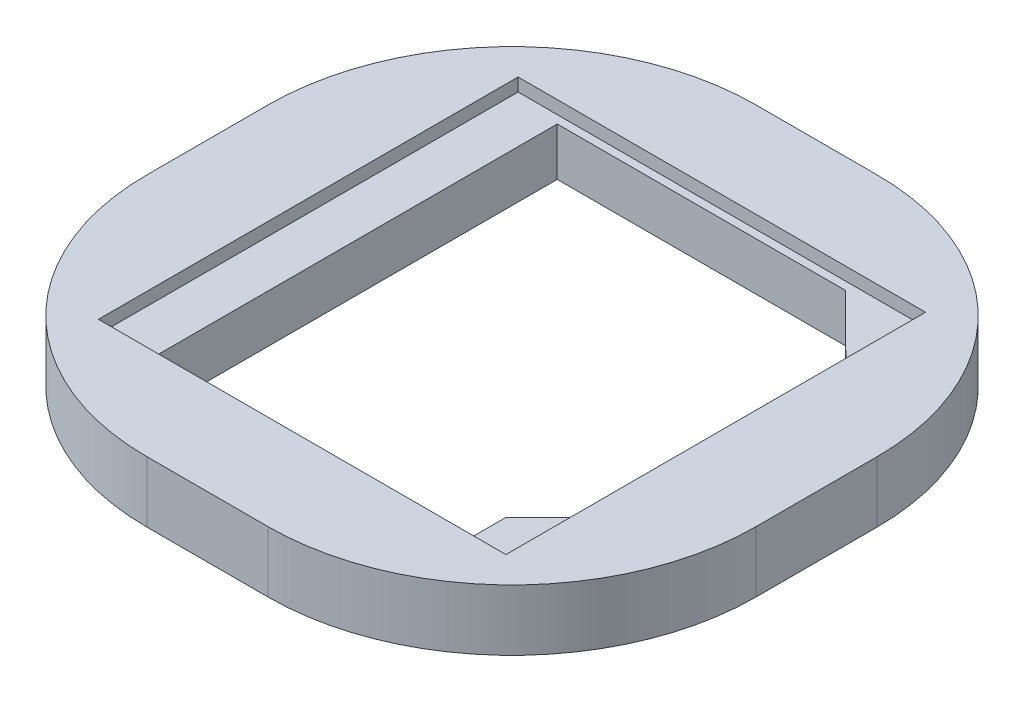
ISO-10303-21;
HEADER;
FILE_DESCRIPTION(('STEP AP214'),'2;1');
FILE_NAME('part.step','',(''),(''),'','','');
FILE_SCHEMA(('AUTOMOTIVE_DESIGN { 1 0 10303 214 1 1 1 1 }'));
ENDSEC;
DATA;
#1=APPLICATION_CONTEXT('core data for automotive mechanical design processes');
#2=APPLICATION_PROTOCOL_DEFINITION('international standard','automotive_design',2000,#1);
#3=PRODUCT_CONTEXT('',#1,'mechanical');
#4=PRODUCT('Part','Part','',(#3));
#5=PRODUCT_RELATED_PRODUCT_CATEGORY('part','',(#4));
#6=PRODUCT_DEFINITION_FORMATION('','',#4);
#7=PRODUCT_DEFINITION_CONTEXT('part definition',#1,'design');
#8=PRODUCT_DEFINITION('design','',#6,#7);
#9=PRODUCT_DEFINITION_SHAPE('','',#8);
#10=(LENGTH_UNIT() NAMED_UNIT(*) SI_UNIT(.MILLI.,.METRE.));
#11=(NAMED_UNIT(*) PLANE_ANGLE_UNIT() SI_UNIT($,.RADIAN.));
#12=(NAMED_UNIT(*) SI_UNIT($,.STERADIAN.) SOLID_ANGLE_UNIT());
#13=UNCERTAINTY_MEASURE_WITH_UNIT(LENGTH_MEASURE(1.E-05),#10,'distance_accuracy_value','');
#14=(GEOMETRIC_REPRESENTATION_CONTEXT(3) GLOBAL_UNCERTAINTY_ASSIGNED_CONTEXT((#13)) GLOBAL_UNIT_ASSIGNED_CONTEXT((#10,
#11,#12)) REPRESENTATION_CONTEXT('',''));
#15=CARTESIAN_POINT('',(0.,0.,0.));
#16=DIRECTION('',(0.,0.,1.));
#17=DIRECTION('',(1.,0.,0.));
#18=AXIS2_PLACEMENT_3D('',#15,#16,#17);
#19=CARTESIAN_POINT('',(0.,5.9,0.));
#20=DIRECTION('',(0.,-1.,0.));
#21=DIRECTION('',(0.,0.,-1.));
#22=AXIS2_PLACEMENT_3D('',#19,#20,#21);
#23=PLANE('',#22);
#24=DIRECTION('',(0.,0.,-1.));
#25=VECTOR('',#24,1.);
#26=CARTESIAN_POINT('',(19.4909070437608,5.9,20.2860703771462));
#27=LINE('',#26,#25);
#28=CARTESIAN_POINT('',(19.4909070437608,5.9,25.8));
#29=VERTEX_POINT('',#28);
#30=CARTESIAN_POINT('',(19.4909070437608,5.9,20.2860703771462));
#31=VERTEX_POINT('',#30);
#32=EDGE_CURVE('E188',#29,#31,#27,.T.);
#33=ORIENTED_EDGE('',*,*,#32,.F.);
#34=DIRECTION('',(1.,0.,0.));
#35=VECTOR('',#34,1.);
#36=CARTESIAN_POINT('',(-25.05,5.9,25.8));
#37=LINE('',#36,#35);
#38=CARTESIAN_POINT('',(25.05,5.9,25.8));
#39=VERTEX_POINT('',#38);
#40=EDGE_CURVE('E237',#29,#39,#37,.T.);
#41=ORIENTED_EDGE('',*,*,#40,.T.);
#42=DIRECTION('',(0.,0.,-1.));
#43=VECTOR('',#42,1.);
#44=CARTESIAN_POINT('',(25.05,5.9,25.8));
#45=LINE('',#44,#43);
#46=CARTESIAN_POINT('',(25.05,5.9,14.6953944265383));
#47=VERTEX_POINT('',#46);
#48=EDGE_CURVE('E227',#39,#47,#45,.T.);
#49=ORIENTED_EDGE('',*,*,#48,.T.);
#50=DIRECTION('',(0.705100991681893,0.,-0.709106897110168));
#51=VECTOR('',#50,1.);
#52=CARTESIAN_POINT('',(25.05,5.9,14.6953944265383));
#53=LINE('',#52,#51);
#54=EDGE_CURVE('E540',#31,#47,#53,.T.);
#55=ORIENTED_EDGE('',*,*,#54,.F.);
#56=EDGE_LOOP('',(#33,#41,#49,#55));
#57=FACE_BOUND('',#56,.T.);
#58=ADVANCED_FACE('F39',(#57),#23,.F.);
#59=DIRECTION('',(-0.709106897110168,0.,-0.705100991681893));
#60=VECTOR('',#59,1.);
#61=CARTESIAN_POINT('',(16.1992306819209,5.9,-24.8007262920677));
#62=LINE('',#61,#60);
#63=CARTESIAN_POINT('',(25.05,5.9,-15.9999569739889));
#64=VERTEX_POINT('',#63);
#65=CARTESIAN_POINT('',(16.1992306819209,5.9,-24.8007262920677));
#66=VERTEX_POINT('',#65);
#67=EDGE_CURVE('E535',#64,#66,#62,.T.);
#68=ORIENTED_EDGE('',*,*,#67,.F.);
#69=CARTESIAN_POINT('',(25.05,5.9,-25.8));
#70=VERTEX_POINT('',#69);
#71=EDGE_CURVE('E231',#64,#70,#45,.T.);
#72=ORIENTED_EDGE('',*,*,#71,.T.);
#73=DIRECTION('',(-1.,0.,0.));
#74=VECTOR('',#73,1.);
#75=CARTESIAN_POINT('',(-25.05,5.9,-25.8));
#76=LINE('',#75,#74);
#77=CARTESIAN_POINT('',(-25.05,5.9,-25.8));
#78=VERTEX_POINT('',#77);
#79=EDGE_CURVE('E230',#70,#78,#76,.T.);
#80=ORIENTED_EDGE('',*,*,#79,.T.);
#81=DIRECTION('',(0.,0.,1.));
#82=VECTOR('',#81,1.);
#83=CARTESIAN_POINT('',(-25.05,5.9,25.8));
#84=LINE('',#83,#82);
#85=CARTESIAN_POINT('',(-25.05,5.9,25.8));
#86=VERTEX_POINT('',#85);
#87=EDGE_CURVE('E234',#78,#86,#84,.T.);
#88=ORIENTED_EDGE('',*,*,#87,.T.);
#89=CARTESIAN_POINT('',(-19.2380081819395,5.9,25.8));
#90=VERTEX_POINT('',#89);
#91=EDGE_CURVE('E238',#86,#90,#37,.T.);
#92=ORIENTED_EDGE('',*,*,#91,.T.);
#93=DIRECTION('',(0.,0.,1.));
#94=VECTOR('',#93,1.);
#95=CARTESIAN_POINT('',(-19.2380081819395,5.9,25.8));
#96=LINE('',#95,#94);
#97=CARTESIAN_POINT('',(-19.2380081819395,5.9,-24.8007262920677));
#98=VERTEX_POINT('',#97);
#99=EDGE_CURVE('E195',#98,#90,#96,.T.);
#100=ORIENTED_EDGE('',*,*,#99,.F.);
#101=DIRECTION('',(-1.,0.,0.));
#102=VECTOR('',#101,1.);
#103=CARTESIAN_POINT('',(-19.2380081819395,5.9,-24.8007262920677));
#104=LINE('',#103,#102);
#105=EDGE_CURVE('E198',#66,#98,#104,.T.);
#106=ORIENTED_EDGE('',*,*,#105,.F.);
#107=EDGE_LOOP('',(#68,#72,#80,#88,#92,#100,#106));
#108=FACE_BOUND('',#107,.T.);
#109=ADVANCED_FACE('F347',(#108),#23,.F.);
#110=CARTESIAN_POINT('',(37.45,7.5,37.45));
#111=DIRECTION('',(-1.,0.,0.));
#112=DIRECTION('',(0.,0.,1.));
#113=AXIS2_PLACEMENT_3D('',#110,#111,#112);
#114=PLANE('',#113);
#115=DIRECTION('',(0.,0.,-1.));
#116=VECTOR('',#115,1.);
#117=CARTESIAN_POINT('',(37.45,0.,37.45));
#118=LINE('',#117,#116);
#119=CARTESIAN_POINT('',(37.45,0.,7.45000000000001));
#120=VERTEX_POINT('',#119);
#121=CARTESIAN_POINT('',(37.45,0.,-7.45000000000001));
#122=VERTEX_POINT('',#121);
#123=EDGE_CURVE('E254',#120,#122,#118,.T.);
#124=ORIENTED_EDGE('',*,*,#123,.T.);
#125=DIRECTION('',(0.,-1.,0.));
#126=VECTOR('',#125,1.);
#127=CARTESIAN_POINT('',(37.45,7.5,-7.45000000000001));
#128=LINE('',#127,#126);
#129=CARTESIAN_POINT('',(37.45,7.5,-7.45000000000001));
#130=VERTEX_POINT('',#129);
#131=EDGE_CURVE('E297',#122,#130,#128,.F.);
#132=ORIENTED_EDGE('',*,*,#131,.T.);
#133=DIRECTION('',(0.,0.,-1.));
#134=VECTOR('',#133,1.);
#135=CARTESIAN_POINT('',(37.45,7.5,37.45));
#136=LINE('',#135,#134);
#137=CARTESIAN_POINT('',(37.45,7.5,7.45000000000001));
#138=VERTEX_POINT('',#137);
#139=EDGE_CURVE('E261',#138,#130,#136,.T.);
#140=ORIENTED_EDGE('',*,*,#139,.F.);
#141=DIRECTION('',(0.,-1.,0.));
#142=VECTOR('',#141,1.);
#143=CARTESIAN_POINT('',(37.45,7.5,7.45000000000001));
#144=LINE('',#143,#142);
#145=EDGE_CURVE('E294',#138,#120,#144,.T.);
#146=ORIENTED_EDGE('',*,*,#145,.T.);
#147=EDGE_LOOP('',(#124,#132,#140,#146));
#148=FACE_BOUND('',#147,.T.);
#149=ADVANCED_FACE('F332',(#148),#114,.F.);
#150=CARTESIAN_POINT('',(-37.45,7.5,-37.45));
#151=DIRECTION('',(0.,0.,1.));
#152=DIRECTION('',(1.,0.,0.));
#153=AXIS2_PLACEMENT_3D('',#150,#151,#152);
#154=PLANE('',#153);
#155=DIRECTION('',(-1.,0.,0.));
#156=VECTOR('',#155,1.);
#157=CARTESIAN_POINT('',(-37.45,7.5,-37.45));
#158=LINE('',#157,#156);
#159=CARTESIAN_POINT('',(7.45000000000002,7.5,-37.45));
#160=VERTEX_POINT('',#159);
#161=CARTESIAN_POINT('',(-7.44999999999999,7.5,-37.45));
#162=VERTEX_POINT('',#161);
#163=EDGE_CURVE('E264',#160,#162,#158,.T.);
#164=ORIENTED_EDGE('',*,*,#163,.F.);
#165=DIRECTION('',(0.,-1.,0.));
#166=VECTOR('',#165,1.);
#167=CARTESIAN_POINT('',(7.45000000000002,7.5,-37.45));
#168=LINE('',#167,#166);
#169=CARTESIAN_POINT('',(7.45000000000002,0.,-37.45));
#170=VERTEX_POINT('',#169);
#171=EDGE_CURVE('E283',#160,#170,#168,.T.);
#172=ORIENTED_EDGE('',*,*,#171,.T.);
#173=DIRECTION('',(-1.,0.,0.));
#174=VECTOR('',#173,1.);
#175=CARTESIAN_POINT('',(-37.45,0.,-37.45));
#176=LINE('',#175,#174);
#177=CARTESIAN_POINT('',(-7.44999999999999,0.,-37.45));
#178=VERTEX_POINT('',#177);
#179=EDGE_CURVE('E275',#170,#178,#176,.T.);
#180=ORIENTED_EDGE('',*,*,#179,.T.);
#181=DIRECTION('',(0.,-1.,0.));
#182=VECTOR('',#181,1.);
#183=CARTESIAN_POINT('',(-7.44999999999999,7.5,-37.45));
#184=LINE('',#183,#182);
#185=EDGE_CURVE('E272',#178,#162,#184,.F.);
#186=ORIENTED_EDGE('',*,*,#185,.T.);
#187=EDGE_LOOP('',(#164,#172,#180,#186));
#188=FACE_BOUND('',#187,.T.);
#189=ADVANCED_FACE('F340',(#188),#154,.F.);
#190=CARTESIAN_POINT('',(-37.45,7.5,37.45));
#191=DIRECTION('',(1.,0.,0.));
#192=DIRECTION('',(0.,0.,-1.));
#193=AXIS2_PLACEMENT_3D('',#190,#191,#192);
#194=PLANE('',#193);
#195=DIRECTION('',(0.,0.,1.));
#196=VECTOR('',#195,1.);
#197=CARTESIAN_POINT('',(-37.45,0.,37.45));
#198=LINE('',#197,#196);
#199=CARTESIAN_POINT('',(-37.45,0.,-7.45000000000001));
#200=VERTEX_POINT('',#199);
#201=CARTESIAN_POINT('',(-37.45,0.,7.45000000000001));
#202=VERTEX_POINT('',#201);
#203=EDGE_CURVE('E278',#200,#202,#198,.T.);
#204=ORIENTED_EDGE('',*,*,#203,.T.);
#205=DIRECTION('',(0.,-1.,0.));
#206=VECTOR('',#205,1.);
#207=CARTESIAN_POINT('',(-37.45,7.5,7.45000000000001));
#208=LINE('',#207,#206);
#209=CARTESIAN_POINT('',(-37.45,7.5,7.45000000000001));
#210=VERTEX_POINT('',#209);
#211=EDGE_CURVE('E11',#202,#210,#208,.F.);
#212=ORIENTED_EDGE('',*,*,#211,.T.);
#213=DIRECTION('',(0.,0.,1.));
#214=VECTOR('',#213,1.);
#215=CARTESIAN_POINT('',(-37.45,7.5,37.45));
#216=LINE('',#215,#214);
#217=CARTESIAN_POINT('',(-37.45,7.5,-7.45000000000001));
#218=VERTEX_POINT('',#217);
#219=EDGE_CURVE('E268',#218,#210,#216,.T.);
#220=ORIENTED_EDGE('',*,*,#219,.F.);
#221=DIRECTION('',(0.,-1.,0.));
#222=VECTOR('',#221,1.);
#223=CARTESIAN_POINT('',(-37.45,7.5,-7.45000000000001));
#224=LINE('',#223,#222);
#225=EDGE_CURVE('E47',#218,#200,#224,.T.);
#226=ORIENTED_EDGE('',*,*,#225,.T.);
#227=EDGE_LOOP('',(#204,#212,#220,#226));
#228=FACE_BOUND('',#227,.T.);
#229=ADVANCED_FACE('F314',(#228),#194,.F.);
#230=CARTESIAN_POINT('',(-37.45,7.5,37.45));
#231=DIRECTION('',(0.,0.,-1.));
#232=DIRECTION('',(-1.,0.,0.));
#233=AXIS2_PLACEMENT_3D('',#230,#231,#232);
#234=PLANE('',#233);
#235=DIRECTION('',(1.,0.,0.));
#236=VECTOR('',#235,1.);
#237=CARTESIAN_POINT('',(-37.45,0.,37.45));
#238=LINE('',#237,#236);
#239=CARTESIAN_POINT('',(-7.44999999999999,0.,37.45));
#240=VERTEX_POINT('',#239);
#241=CARTESIAN_POINT('',(7.45000000000002,0.,37.45));
#242=VERTEX_POINT('',#241);
#243=EDGE_CURVE('E265',#240,#242,#238,.T.);
#244=ORIENTED_EDGE('',*,*,#243,.T.);
#245=DIRECTION('',(0.,-1.,0.));
#246=VECTOR('',#245,1.);
#247=CARTESIAN_POINT('',(7.45000000000002,7.5,37.45));
#248=LINE('',#247,#246);
#249=CARTESIAN_POINT('',(7.45000000000002,7.5,37.45));
#250=VERTEX_POINT('',#249);
#251=EDGE_CURVE('E54',#242,#250,#248,.F.);
#252=ORIENTED_EDGE('',*,*,#251,.T.);
#253=DIRECTION('',(1.,0.,0.));
#254=VECTOR('',#253,1.);
#255=CARTESIAN_POINT('',(-37.45,7.5,37.45));
#256=LINE('',#255,#254);
#257=CARTESIAN_POINT('',(-7.44999999999999,7.5,37.45));
#258=VERTEX_POINT('',#257);
#259=EDGE_CURVE('E270',#258,#250,#256,.T.);
#260=ORIENTED_EDGE('',*,*,#259,.F.);
#261=DIRECTION('',(0.,-1.,0.));
#262=VECTOR('',#261,1.);
#263=CARTESIAN_POINT('',(-7.44999999999999,7.5,37.45));
#264=LINE('',#263,#262);
#265=EDGE_CURVE('E306',#258,#240,#264,.T.);
#266=ORIENTED_EDGE('',*,*,#265,.T.);
#267=EDGE_LOOP('',(#244,#252,#260,#266));
#268=FACE_BOUND('',#267,.T.);
#269=ADVANCED_FACE('F323',(#268),#234,.F.);
#270=CARTESIAN_POINT('',(0.,7.5,0.));
#271=DIRECTION('',(0.,-1.,0.));
#272=DIRECTION('',(0.,0.,-1.));
#273=AXIS2_PLACEMENT_3D('',#270,#271,#272);
#274=PLANE('',#273);
#275=DIRECTION('',(-1.,0.,0.));
#276=VECTOR('',#275,1.);
#277=CARTESIAN_POINT('',(-25.05,7.5,-25.8));
#278=LINE('',#277,#276);
#279=CARTESIAN_POINT('',(25.05,7.5,-25.8));
#280=VERTEX_POINT('',#279);
#281=CARTESIAN_POINT('',(-25.05,7.5,-25.8));
#282=VERTEX_POINT('',#281);
#283=EDGE_CURVE('E243',#280,#282,#278,.T.);
#284=ORIENTED_EDGE('',*,*,#283,.F.);
#285=DIRECTION('',(0.,0.,-1.));
#286=VECTOR('',#285,1.);
#287=CARTESIAN_POINT('',(25.05,7.5,25.8));
#288=LINE('',#287,#286);
#289=CARTESIAN_POINT('',(25.05,7.5,25.8));
#290=VERTEX_POINT('',#289);
#291=EDGE_CURVE('E226',#290,#280,#288,.T.);
#292=ORIENTED_EDGE('',*,*,#291,.F.);
#293=DIRECTION('',(1.,0.,0.));
#294=VECTOR('',#293,1.);
#295=CARTESIAN_POINT('',(-25.05,7.5,25.8));
#296=LINE('',#295,#294);
#297=CARTESIAN_POINT('',(-25.05,7.5,25.8));
#298=VERTEX_POINT('',#297);
#299=EDGE_CURVE('E249',#298,#290,#296,.T.);
#300=ORIENTED_EDGE('',*,*,#299,.F.);
#301=DIRECTION('',(0.,0.,1.));
#302=VECTOR('',#301,1.);
#303=CARTESIAN_POINT('',(-25.05,7.5,25.8));
#304=LINE('',#303,#302);
#305=EDGE_CURVE('E246',#282,#298,#304,.T.);
#306=ORIENTED_EDGE('',*,*,#305,.F.);
#307=EDGE_LOOP('',(#284,#292,#300,#306));
#308=FACE_BOUND('',#307,.T.);
#309=ORIENTED_EDGE('',*,*,#139,.T.);
#310=CARTESIAN_POINT('',(7.45000000000002,7.5,-7.45000000000001));
#311=DIRECTION('',(0.,-1.,0.));
#312=DIRECTION('',(0.,0.,-1.));
#313=AXIS2_PLACEMENT_3D('',#310,#311,#312);
#314=CIRCLE('',#313,30.);
#315=EDGE_CURVE('E304',#130,#160,#314,.F.);
#316=ORIENTED_EDGE('',*,*,#315,.T.);
#317=ORIENTED_EDGE('',*,*,#163,.T.);
#318=CARTESIAN_POINT('',(-7.44999999999999,7.5,-7.45000000000001));
#319=DIRECTION('',(0.,-1.,0.));
#320=DIRECTION('',(0.,0.,-1.));
#321=AXIS2_PLACEMENT_3D('',#318,#319,#320);
#322=CIRCLE('',#321,30.);
#323=EDGE_CURVE('E299',#162,#218,#322,.F.);
#324=ORIENTED_EDGE('',*,*,#323,.T.);
#325=ORIENTED_EDGE('',*,*,#219,.T.);
#326=CARTESIAN_POINT('',(-7.44999999999999,7.5,7.45000000000001));
#327=DIRECTION('',(0.,-1.,0.));
#328=DIRECTION('',(0.,0.,-1.));
#329=AXIS2_PLACEMENT_3D('',#326,#327,#328);
#330=CIRCLE('',#329,30.);
#331=EDGE_CURVE('E61',#210,#258,#330,.F.);
#332=ORIENTED_EDGE('',*,*,#331,.T.);
#333=ORIENTED_EDGE('',*,*,#259,.T.);
#334=CARTESIAN_POINT('',(7.45000000000002,7.5,7.45000000000001));
#335=DIRECTION('',(0.,-1.,0.));
#336=DIRECTION('',(0.,0.,-1.));
#337=AXIS2_PLACEMENT_3D('',#334,#335,#336);
#338=CIRCLE('',#337,30.);
#339=EDGE_CURVE('E302',#250,#138,#338,.F.);
#340=ORIENTED_EDGE('',*,*,#339,.T.);
#341=EDGE_LOOP('',(#309,#316,#317,#324,#325,#332,#333,#340));
#342=FACE_BOUND('',#341,.T.);
#343=ADVANCED_FACE('F325',(#308,#342),#274,.F.);
#344=CARTESIAN_POINT('',(0.,0.,0.));
#345=DIRECTION('',(0.,-1.,0.));
#346=DIRECTION('',(0.,0.,-1.));
#347=AXIS2_PLACEMENT_3D('',#344,#345,#346);
#348=PLANE('',#347);
#349=DIRECTION('',(0.,0.,-1.));
#350=VECTOR('',#349,1.);
#351=CARTESIAN_POINT('',(19.4909070437608,0.,20.2860703771462));
#352=LINE('',#351,#350);
#353=CARTESIAN_POINT('',(19.4909070437608,0.,25.8));
#354=VERTEX_POINT('',#353);
#355=CARTESIAN_POINT('',(19.4909070437608,0.,20.2860703771462));
#356=VERTEX_POINT('',#355);
#357=EDGE_CURVE('E185',#354,#356,#352,.T.);
#358=ORIENTED_EDGE('',*,*,#357,.T.);
#359=DIRECTION('',(0.705100991681893,0.,-0.709106897110168));
#360=VECTOR('',#359,1.);
#361=CARTESIAN_POINT('',(25.05,0.,14.6953944265383));
#362=LINE('',#361,#360);
#363=CARTESIAN_POINT('',(25.05,0.,14.6953944265383));
#364=VERTEX_POINT('',#363);
#365=EDGE_CURVE('E171',#356,#364,#362,.T.);
#366=ORIENTED_EDGE('',*,*,#365,.T.);
#367=DIRECTION('',(0.,0.,-1.));
#368=VECTOR('',#367,1.);
#369=CARTESIAN_POINT('',(25.05,0.,-15.9999569739889));
#370=LINE('',#369,#368);
#371=CARTESIAN_POINT('',(25.05,0.,-15.9999569739889));
#372=VERTEX_POINT('',#371);
#373=EDGE_CURVE('E217',#364,#372,#370,.T.);
#374=ORIENTED_EDGE('',*,*,#373,.T.);
#375=DIRECTION('',(-0.709106897110168,0.,-0.705100991681893));
#376=VECTOR('',#375,1.);
#377=CARTESIAN_POINT('',(16.1992306819209,0.,-24.8007262920677));
#378=LINE('',#377,#376);
#379=CARTESIAN_POINT('',(16.1992306819209,0.,-24.8007262920677));
#380=VERTEX_POINT('',#379);
#381=EDGE_CURVE('E213',#372,#380,#378,.T.);
#382=ORIENTED_EDGE('',*,*,#381,.T.);
#383=DIRECTION('',(-1.,0.,0.));
#384=VECTOR('',#383,1.);
#385=CARTESIAN_POINT('',(-19.2380081819395,0.,-24.8007262920677));
#386=LINE('',#385,#384);
#387=CARTESIAN_POINT('',(-19.2380081819395,0.,-24.8007262920677));
#388=VERTEX_POINT('',#387);
#389=EDGE_CURVE('E209',#380,#388,#386,.T.);
#390=ORIENTED_EDGE('',*,*,#389,.T.);
#391=DIRECTION('',(0.,0.,1.));
#392=VECTOR('',#391,1.);
#393=CARTESIAN_POINT('',(-19.2380081819395,0.,25.8));
#394=LINE('',#393,#392);
#395=CARTESIAN_POINT('',(-19.2380081819395,0.,25.8));
#396=VERTEX_POINT('',#395);
#397=EDGE_CURVE('E206',#388,#396,#394,.T.);
#398=ORIENTED_EDGE('',*,*,#397,.T.);
#399=DIRECTION('',(1.,0.,0.));
#400=VECTOR('',#399,1.);
#401=CARTESIAN_POINT('',(19.4909070437608,0.,25.8));
#402=LINE('',#401,#400);
#403=EDGE_CURVE('E194',#396,#354,#402,.T.);
#404=ORIENTED_EDGE('',*,*,#403,.T.);
#405=EDGE_LOOP('',(#358,#366,#374,#382,#390,#398,#404));
#406=FACE_BOUND('',#405,.T.);
#407=ORIENTED_EDGE('',*,*,#179,.F.);
#408=CARTESIAN_POINT('',(7.45000000000002,0.,-7.45000000000001));
#409=DIRECTION('',(0.,-1.,0.));
#410=DIRECTION('',(0.,0.,-1.));
#411=AXIS2_PLACEMENT_3D('',#408,#409,#410);
#412=CIRCLE('',#411,30.);
#413=EDGE_CURVE('E292',#170,#122,#412,.T.);
#414=ORIENTED_EDGE('',*,*,#413,.T.);
#415=ORIENTED_EDGE('',*,*,#123,.F.);
#416=CARTESIAN_POINT('',(7.45000000000002,0.,7.45000000000001));
#417=DIRECTION('',(0.,-1.,0.));
#418=DIRECTION('',(0.,0.,-1.));
#419=AXIS2_PLACEMENT_3D('',#416,#417,#418);
#420=CIRCLE('',#419,30.);
#421=EDGE_CURVE('E290',#120,#242,#420,.T.);
#422=ORIENTED_EDGE('',*,*,#421,.T.);
#423=ORIENTED_EDGE('',*,*,#243,.F.);
#424=CARTESIAN_POINT('',(-7.44999999999999,0.,7.45000000000001));
#425=DIRECTION('',(0.,-1.,0.));
#426=DIRECTION('',(0.,0.,-1.));
#427=AXIS2_PLACEMENT_3D('',#424,#425,#426);
#428=CIRCLE('',#427,30.);
#429=EDGE_CURVE('E288',#240,#202,#428,.T.);
#430=ORIENTED_EDGE('',*,*,#429,.T.);
#431=ORIENTED_EDGE('',*,*,#203,.F.);
#432=CARTESIAN_POINT('',(-7.44999999999999,0.,-7.45000000000001));
#433=DIRECTION('',(0.,-1.,0.));
#434=DIRECTION('',(0.,0.,-1.));
#435=AXIS2_PLACEMENT_3D('',#432,#433,#434);
#436=CIRCLE('',#435,30.);
#437=EDGE_CURVE('E286',#200,#178,#436,.T.);
#438=ORIENTED_EDGE('',*,*,#437,.T.);
#439=EDGE_LOOP('',(#407,#414,#415,#422,#423,#430,#431,#438));
#440=FACE_BOUND('',#439,.T.);
#441=ADVANCED_FACE('F191',(#406,#440),#348,.T.);
#442=CARTESIAN_POINT('',(25.05,5.9,25.8));
#443=DIRECTION('',(1.,0.,0.));
#444=DIRECTION('',(0.,0.,-1.));
#445=AXIS2_PLACEMENT_3D('',#442,#443,#444);
#446=PLANE('',#445);
#447=ORIENTED_EDGE('',*,*,#291,.T.);
#448=DIRECTION('',(0.,1.,0.));
#449=VECTOR('',#448,1.);
#450=CARTESIAN_POINT('',(25.05,5.9,-25.8));
#451=LINE('',#450,#449);
#452=EDGE_CURVE('E241',#70,#280,#451,.T.);
#453=ORIENTED_EDGE('',*,*,#452,.F.);
#454=ORIENTED_EDGE('',*,*,#71,.F.);
#455=DIRECTION('',(0.,1.,0.));
#456=VECTOR('',#455,1.);
#457=CARTESIAN_POINT('',(25.05,-67.2447854484517,-15.9999569739889));
#458=LINE('',#457,#456);
#459=EDGE_CURVE('E216',#372,#64,#458,.T.);
#460=ORIENTED_EDGE('',*,*,#459,.F.);
#461=ORIENTED_EDGE('',*,*,#373,.F.);
#462=DIRECTION('',(0.,1.,0.));
#463=VECTOR('',#462,1.);
#464=CARTESIAN_POINT('',(25.05,-67.2447854484517,14.6953944265383));
#465=LINE('',#464,#463);
#466=EDGE_CURVE('E177',#364,#47,#465,.T.);
#467=ORIENTED_EDGE('',*,*,#466,.T.);
#468=ORIENTED_EDGE('',*,*,#48,.F.);
#469=DIRECTION('',(0.,1.,0.));
#470=VECTOR('',#469,1.);
#471=CARTESIAN_POINT('',(25.05,5.9,25.8));
#472=LINE('',#471,#470);
#473=EDGE_CURVE('E252',#39,#290,#472,.T.);
#474=ORIENTED_EDGE('',*,*,#473,.T.);
#475=EDGE_LOOP('',(#447,#453,#454,#460,#461,#467,#468,#474));
#476=FACE_BOUND('',#475,.T.);
#477=ADVANCED_FACE('F362',(#476),#446,.F.);
#478=CARTESIAN_POINT('',(-25.05,5.9,25.8));
#479=DIRECTION('',(0.,0.,1.));
#480=DIRECTION('',(1.,0.,0.));
#481=AXIS2_PLACEMENT_3D('',#478,#479,#480);
#482=PLANE('',#481);
#483=ORIENTED_EDGE('',*,*,#299,.T.);
#484=ORIENTED_EDGE('',*,*,#473,.F.);
#485=ORIENTED_EDGE('',*,*,#40,.F.);
#486=DIRECTION('',(0.,1.,0.));
#487=VECTOR('',#486,1.);
#488=CARTESIAN_POINT('',(19.4909070437608,-67.2447854484517,25.8));
#489=LINE('',#488,#487);
#490=EDGE_CURVE('E204',#354,#29,#489,.T.);
#491=ORIENTED_EDGE('',*,*,#490,.F.);
#492=ORIENTED_EDGE('',*,*,#403,.F.);
#493=DIRECTION('',(0.,1.,0.));
#494=VECTOR('',#493,1.);
#495=CARTESIAN_POINT('',(-19.2380081819395,-67.2447854484517,25.8));
#496=LINE('',#495,#494);
#497=EDGE_CURVE('E205',#396,#90,#496,.T.);
#498=ORIENTED_EDGE('',*,*,#497,.T.);
#499=ORIENTED_EDGE('',*,*,#91,.F.);
#500=DIRECTION('',(0.,1.,0.));
#501=VECTOR('',#500,1.);
#502=CARTESIAN_POINT('',(-25.05,5.9,25.8));
#503=LINE('',#502,#501);
#504=EDGE_CURVE('E255',#86,#298,#503,.T.);
#505=ORIENTED_EDGE('',*,*,#504,.T.);
#506=EDGE_LOOP('',(#483,#484,#485,#491,#492,#498,#499,#505));
#507=FACE_BOUND('',#506,.T.);
#508=ADVANCED_FACE('F358',(#507),#482,.F.);
#509=CARTESIAN_POINT('',(-25.05,5.9,25.8));
#510=DIRECTION('',(-1.,0.,0.));
#511=DIRECTION('',(0.,0.,1.));
#512=AXIS2_PLACEMENT_3D('',#509,#510,#511);
#513=PLANE('',#512);
#514=ORIENTED_EDGE('',*,*,#305,.T.);
#515=ORIENTED_EDGE('',*,*,#504,.F.);
#516=ORIENTED_EDGE('',*,*,#87,.F.);
#517=DIRECTION('',(0.,1.,0.));
#518=VECTOR('',#517,1.);
#519=CARTESIAN_POINT('',(-25.05,5.9,-25.8));
#520=LINE('',#519,#518);
#521=EDGE_CURVE('E257',#78,#282,#520,.T.);
#522=ORIENTED_EDGE('',*,*,#521,.T.);
#523=EDGE_LOOP('',(#514,#515,#516,#522));
#524=FACE_BOUND('',#523,.T.);
#525=ADVANCED_FACE('F361',(#524),#513,.F.);
#526=CARTESIAN_POINT('',(-25.05,5.9,-25.8));
#527=DIRECTION('',(0.,0.,-1.));
#528=DIRECTION('',(-1.,0.,0.));
#529=AXIS2_PLACEMENT_3D('',#526,#527,#528);
#530=PLANE('',#529);
#531=ORIENTED_EDGE('',*,*,#283,.T.);
#532=ORIENTED_EDGE('',*,*,#521,.F.);
#533=ORIENTED_EDGE('',*,*,#79,.F.);
#534=ORIENTED_EDGE('',*,*,#452,.T.);
#535=EDGE_LOOP('',(#531,#532,#533,#534));
#536=FACE_BOUND('',#535,.T.);
#537=ADVANCED_FACE('F366',(#536),#530,.F.);
#538=CARTESIAN_POINT('',(19.4909070437608,-67.2447854484517,20.2860703771462));
#539=DIRECTION('',(1.,0.,0.));
#540=DIRECTION('',(0.,0.,-1.));
#541=AXIS2_PLACEMENT_3D('',#538,#539,#540);
#542=PLANE('',#541);
#543=ORIENTED_EDGE('',*,*,#490,.T.);
#544=ORIENTED_EDGE('',*,*,#32,.T.);
#545=DIRECTION('',(0.,1.,0.));
#546=VECTOR('',#545,1.);
#547=CARTESIAN_POINT('',(19.4909070437608,-67.2447854484517,20.2860703771462));
#548=LINE('',#547,#546);
#549=EDGE_CURVE('E175',#356,#31,#548,.T.);
#550=ORIENTED_EDGE('',*,*,#549,.F.);
#551=ORIENTED_EDGE('',*,*,#357,.F.);
#552=EDGE_LOOP('',(#543,#544,#550,#551));
#553=FACE_BOUND('',#552,.T.);
#554=ADVANCED_FACE('F184',(#553),#542,.F.);
#555=CARTESIAN_POINT('',(25.05,-67.2447854484517,14.6953944265383));
#556=DIRECTION('',(0.709106897110168,0.,0.705100991681893));
#557=DIRECTION('',(0.705100991681893,0.,-0.709106897110168));
#558=AXIS2_PLACEMENT_3D('',#555,#556,#557);
#559=PLANE('',#558);
#560=ORIENTED_EDGE('',*,*,#549,.T.);
#561=ORIENTED_EDGE('',*,*,#54,.T.);
#562=ORIENTED_EDGE('',*,*,#466,.F.);
#563=ORIENTED_EDGE('',*,*,#365,.F.);
#564=EDGE_LOOP('',(#560,#561,#562,#563));
#565=FACE_BOUND('',#564,.T.);
#566=ADVANCED_FACE('F173',(#565),#559,.F.);
#567=CARTESIAN_POINT('',(16.1992306819209,-67.2447854484517,-24.8007262920677));
#568=DIRECTION('',(0.705100991681893,0.,-0.709106897110168));
#569=DIRECTION('',(-0.709106897110168,0.,-0.705100991681893));
#570=AXIS2_PLACEMENT_3D('',#567,#568,#569);
#571=PLANE('',#570);
#572=ORIENTED_EDGE('',*,*,#459,.T.);
#573=ORIENTED_EDGE('',*,*,#67,.T.);
#574=DIRECTION('',(0.,1.,0.));
#575=VECTOR('',#574,1.);
#576=CARTESIAN_POINT('',(16.1992306819209,-67.2447854484517,-24.8007262920677));
#577=LINE('',#576,#575);
#578=EDGE_CURVE('E212',#380,#66,#577,.T.);
#579=ORIENTED_EDGE('',*,*,#578,.F.);
#580=ORIENTED_EDGE('',*,*,#381,.F.);
#581=EDGE_LOOP('',(#572,#573,#579,#580));
#582=FACE_BOUND('',#581,.T.);
#583=ADVANCED_FACE('F426',(#582),#571,.F.);
#584=CARTESIAN_POINT('',(-19.2380081819395,-67.2447854484517,-24.8007262920677));
#585=DIRECTION('',(0.,0.,-1.));
#586=DIRECTION('',(-1.,0.,0.));
#587=AXIS2_PLACEMENT_3D('',#584,#585,#586);
#588=PLANE('',#587);
#589=ORIENTED_EDGE('',*,*,#578,.T.);
#590=ORIENTED_EDGE('',*,*,#105,.T.);
#591=DIRECTION('',(0.,1.,0.));
#592=VECTOR('',#591,1.);
#593=CARTESIAN_POINT('',(-19.2380081819395,-67.2447854484517,-24.8007262920677));
#594=LINE('',#593,#592);
#595=EDGE_CURVE('E208',#388,#98,#594,.T.);
#596=ORIENTED_EDGE('',*,*,#595,.F.);
#597=ORIENTED_EDGE('',*,*,#389,.F.);
#598=EDGE_LOOP('',(#589,#590,#596,#597));
#599=FACE_BOUND('',#598,.T.);
#600=ADVANCED_FACE('F417',(#599),#588,.F.);
#601=CARTESIAN_POINT('',(-19.2380081819395,-67.2447854484517,25.8));
#602=DIRECTION('',(-1.,0.,0.));
#603=DIRECTION('',(0.,0.,1.));
#604=AXIS2_PLACEMENT_3D('',#601,#602,#603);
#605=PLANE('',#604);
#606=ORIENTED_EDGE('',*,*,#595,.T.);
#607=ORIENTED_EDGE('',*,*,#99,.T.);
#608=ORIENTED_EDGE('',*,*,#497,.F.);
#609=ORIENTED_EDGE('',*,*,#397,.F.);
#610=EDGE_LOOP('',(#606,#607,#608,#609));
#611=FACE_BOUND('',#610,.T.);
#612=ADVANCED_FACE('F388',(#611),#605,.F.);
#613=CARTESIAN_POINT('',(7.45000000000002,7.5,-7.45000000000001));
#614=DIRECTION('',(0.,-1.,0.));
#615=DIRECTION('',(0.,0.,-1.));
#616=AXIS2_PLACEMENT_3D('',#613,#614,#615);
#617=CYLINDRICAL_SURFACE('',#616,30.);
#618=ORIENTED_EDGE('',*,*,#315,.F.);
#619=ORIENTED_EDGE('',*,*,#131,.F.);
#620=ORIENTED_EDGE('',*,*,#413,.F.);
#621=ORIENTED_EDGE('',*,*,#171,.F.);
#622=EDGE_LOOP('',(#618,#619,#620,#621));
#623=FACE_BOUND('',#622,.T.);
#624=ADVANCED_FACE('F337',(#623),#617,.T.);
#625=CARTESIAN_POINT('',(7.45000000000002,7.5,7.45000000000001));
#626=DIRECTION('',(0.,-1.,0.));
#627=DIRECTION('',(0.,0.,-1.));
#628=AXIS2_PLACEMENT_3D('',#625,#626,#627);
#629=CYLINDRICAL_SURFACE('',#628,30.);
#630=ORIENTED_EDGE('',*,*,#339,.F.);
#631=ORIENTED_EDGE('',*,*,#251,.F.);
#632=ORIENTED_EDGE('',*,*,#421,.F.);
#633=ORIENTED_EDGE('',*,*,#145,.F.);
#634=EDGE_LOOP('',(#630,#631,#632,#633));
#635=FACE_BOUND('',#634,.T.);
#636=ADVANCED_FACE('F329',(#635),#629,.T.);
#637=CARTESIAN_POINT('',(-7.44999999999999,7.5,7.45000000000001));
#638=DIRECTION('',(0.,-1.,0.));
#639=DIRECTION('',(0.,0.,-1.));
#640=AXIS2_PLACEMENT_3D('',#637,#638,#639);
#641=CYLINDRICAL_SURFACE('',#640,30.);
#642=ORIENTED_EDGE('',*,*,#331,.F.);
#643=ORIENTED_EDGE('',*,*,#211,.F.);
#644=ORIENTED_EDGE('',*,*,#429,.F.);
#645=ORIENTED_EDGE('',*,*,#265,.F.);
#646=EDGE_LOOP('',(#642,#643,#644,#645));
#647=FACE_BOUND('',#646,.T.);
#648=ADVANCED_FACE('F322',(#647),#641,.T.);
#649=CARTESIAN_POINT('',(-7.44999999999999,7.5,-7.45000000000001));
#650=DIRECTION('',(0.,-1.,0.));
#651=DIRECTION('',(0.,0.,-1.));
#652=AXIS2_PLACEMENT_3D('',#649,#650,#651);
#653=CYLINDRICAL_SURFACE('',#652,30.);
#654=ORIENTED_EDGE('',*,*,#323,.F.);
#655=ORIENTED_EDGE('',*,*,#185,.F.);
#656=ORIENTED_EDGE('',*,*,#437,.F.);
#657=ORIENTED_EDGE('',*,*,#225,.F.);
#658=EDGE_LOOP('',(#654,#655,#656,#657));
#659=FACE_BOUND('',#658,.T.);
#660=ADVANCED_FACE('F41',(#659),#653,.T.);
#661=CLOSED_SHELL('',(#58,#109,#149,#189,#229,#269,#343,#441,#477,#508,#525,#537,#554,#566,#583,
#600,#612,#624,#636,#648,#660));
#662=MANIFOLD_SOLID_BREP('B2',#661);
#663=ADVANCED_BREP_SHAPE_REPRESENTATION('',(#18,#662),#14);
#664=SHAPE_DEFINITION_REPRESENTATION(#9,#663);
ENDSEC;
END-ISO-10303-21;
